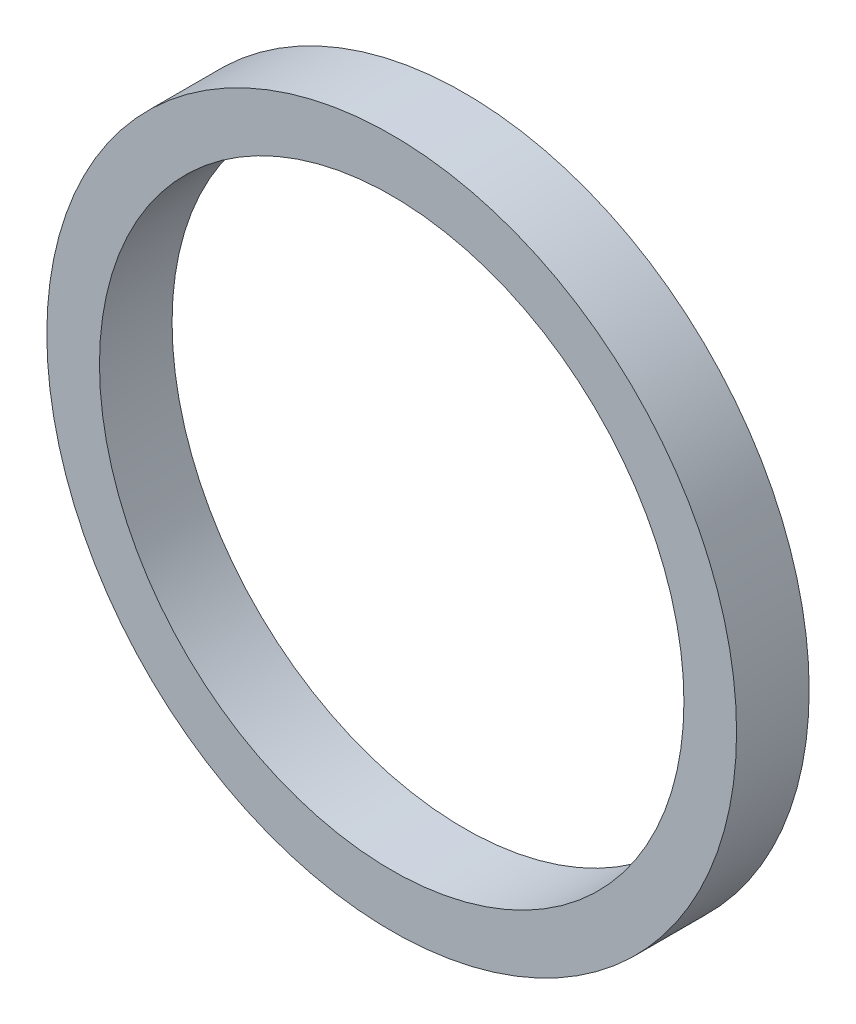
ISO-10303-21;
HEADER;
FILE_DESCRIPTION(('STEP AP214'),'2;1');
FILE_NAME('part.step','',(''),(''),'','','');
FILE_SCHEMA(('AUTOMOTIVE_DESIGN { 1 0 10303 214 1 1 1 1 }'));
ENDSEC;
DATA;
#1=APPLICATION_CONTEXT('core data for automotive mechanical design processes');
#2=APPLICATION_PROTOCOL_DEFINITION('international standard','automotive_design',2000,#1);
#3=PRODUCT_CONTEXT('',#1,'mechanical');
#4=PRODUCT('Part','Part','',(#3));
#5=PRODUCT_RELATED_PRODUCT_CATEGORY('part','',(#4));
#6=PRODUCT_DEFINITION_FORMATION('','',#4);
#7=PRODUCT_DEFINITION_CONTEXT('part definition',#1,'design');
#8=PRODUCT_DEFINITION('design','',#6,#7);
#9=PRODUCT_DEFINITION_SHAPE('','',#8);
#10=(LENGTH_UNIT() NAMED_UNIT(*) SI_UNIT(.MILLI.,.METRE.));
#11=(NAMED_UNIT(*) PLANE_ANGLE_UNIT() SI_UNIT($,.RADIAN.));
#12=(NAMED_UNIT(*) SI_UNIT($,.STERADIAN.) SOLID_ANGLE_UNIT());
#13=UNCERTAINTY_MEASURE_WITH_UNIT(LENGTH_MEASURE(1.E-05),#10,'distance_accuracy_value','');
#14=(GEOMETRIC_REPRESENTATION_CONTEXT(3) GLOBAL_UNCERTAINTY_ASSIGNED_CONTEXT((#13)) GLOBAL_UNIT_ASSIGNED_CONTEXT((#10,
#11,#12)) REPRESENTATION_CONTEXT('',''));
#15=CARTESIAN_POINT('',(0.,0.,0.));
#16=DIRECTION('',(0.,0.,1.));
#17=DIRECTION('',(1.,0.,0.));
#18=AXIS2_PLACEMENT_3D('',#15,#16,#17);
#19=CARTESIAN_POINT('',(0.,0.,2.));
#20=DIRECTION('',(0.,0.,1.));
#21=DIRECTION('',(1.,0.,0.));
#22=AXIS2_PLACEMENT_3D('',#19,#20,#21);
#23=PLANE('',#22);
#24=CARTESIAN_POINT('',(0.,0.,2.));
#25=DIRECTION('',(0.,0.,1.));
#26=DIRECTION('',(1.,0.,0.));
#27=AXIS2_PLACEMENT_3D('',#24,#25,#26);
#28=CIRCLE('',#27,9.5);
#29=CARTESIAN_POINT('',(9.5,0.,2.));
#30=VERTEX_POINT('',#29);
#31=EDGE_CURVE('E10',#30,#30,#28,.T.);
#32=ORIENTED_EDGE('',*,*,#31,.T.);
#33=EDGE_LOOP('',(#32));
#34=FACE_BOUND('',#33,.T.);
#35=CARTESIAN_POINT('',(0.,0.,2.));
#36=DIRECTION('',(0.,0.,1.));
#37=DIRECTION('',(1.,0.,0.));
#38=AXIS2_PLACEMENT_3D('',#35,#36,#37);
#39=CIRCLE('',#38,8.05);
#40=CARTESIAN_POINT('',(8.05,0.,2.));
#41=VERTEX_POINT('',#40);
#42=EDGE_CURVE('E43',#41,#41,#39,.T.);
#43=ORIENTED_EDGE('',*,*,#42,.F.);
#44=EDGE_LOOP('',(#43));
#45=FACE_BOUND('',#44,.T.);
#46=ADVANCED_FACE('F32',(#34,#45),#23,.T.);
#47=CARTESIAN_POINT('',(0.,0.,0.));
#48=DIRECTION('',(0.,0.,1.));
#49=DIRECTION('',(1.,0.,0.));
#50=AXIS2_PLACEMENT_3D('',#47,#48,#49);
#51=PLANE('',#50);
#52=CARTESIAN_POINT('',(0.,0.,0.));
#53=DIRECTION('',(0.,0.,1.));
#54=DIRECTION('',(1.,0.,0.));
#55=AXIS2_PLACEMENT_3D('',#52,#53,#54);
#56=CIRCLE('',#55,9.5);
#57=CARTESIAN_POINT('',(9.5,0.,0.));
#58=VERTEX_POINT('',#57);
#59=EDGE_CURVE('E36',#58,#58,#56,.T.);
#60=ORIENTED_EDGE('',*,*,#59,.F.);
#61=EDGE_LOOP('',(#60));
#62=FACE_BOUND('',#61,.T.);
#63=CARTESIAN_POINT('',(0.,0.,0.));
#64=DIRECTION('',(0.,0.,1.));
#65=DIRECTION('',(1.,0.,0.));
#66=AXIS2_PLACEMENT_3D('',#63,#64,#65);
#67=CIRCLE('',#66,8.05);
#68=CARTESIAN_POINT('',(8.05,0.,0.));
#69=VERTEX_POINT('',#68);
#70=EDGE_CURVE('E45',#69,#69,#67,.T.);
#71=ORIENTED_EDGE('',*,*,#70,.T.);
#72=EDGE_LOOP('',(#71));
#73=FACE_BOUND('',#72,.T.);
#74=ADVANCED_FACE('F55',(#62,#73),#51,.F.);
#75=CARTESIAN_POINT('',(0.,0.,2.));
#76=DIRECTION('',(0.,0.,-1.));
#77=DIRECTION('',(-1.,0.,0.));
#78=AXIS2_PLACEMENT_3D('',#75,#76,#77);
#79=CYLINDRICAL_SURFACE('',#78,9.5);
#80=ORIENTED_EDGE('',*,*,#31,.F.);
#81=EDGE_LOOP('',(#80));
#82=FACE_BOUND('',#81,.T.);
#83=ORIENTED_EDGE('',*,*,#59,.T.);
#84=EDGE_LOOP('',(#83));
#85=FACE_BOUND('',#84,.T.);
#86=ADVANCED_FACE('F34',(#82,#85),#79,.T.);
#87=CARTESIAN_POINT('',(0.,0.,2.));
#88=DIRECTION('',(0.,0.,-1.));
#89=DIRECTION('',(-1.,0.,0.));
#90=AXIS2_PLACEMENT_3D('',#87,#88,#89);
#91=CYLINDRICAL_SURFACE('',#90,8.05);
#92=ORIENTED_EDGE('',*,*,#42,.T.);
#93=EDGE_LOOP('',(#92));
#94=FACE_BOUND('',#93,.T.);
#95=ORIENTED_EDGE('',*,*,#70,.F.);
#96=EDGE_LOOP('',(#95));
#97=FACE_BOUND('',#96,.T.);
#98=ADVANCED_FACE('F51',(#94,#97),#91,.F.);
#99=CLOSED_SHELL('',(#46,#74,#86,#98));
#100=MANIFOLD_SOLID_BREP('B2',#99);
#101=ADVANCED_BREP_SHAPE_REPRESENTATION('',(#18,#100),#14);
#102=SHAPE_DEFINITION_REPRESENTATION(#9,#101);
ENDSEC;
END-ISO-10303-21;
